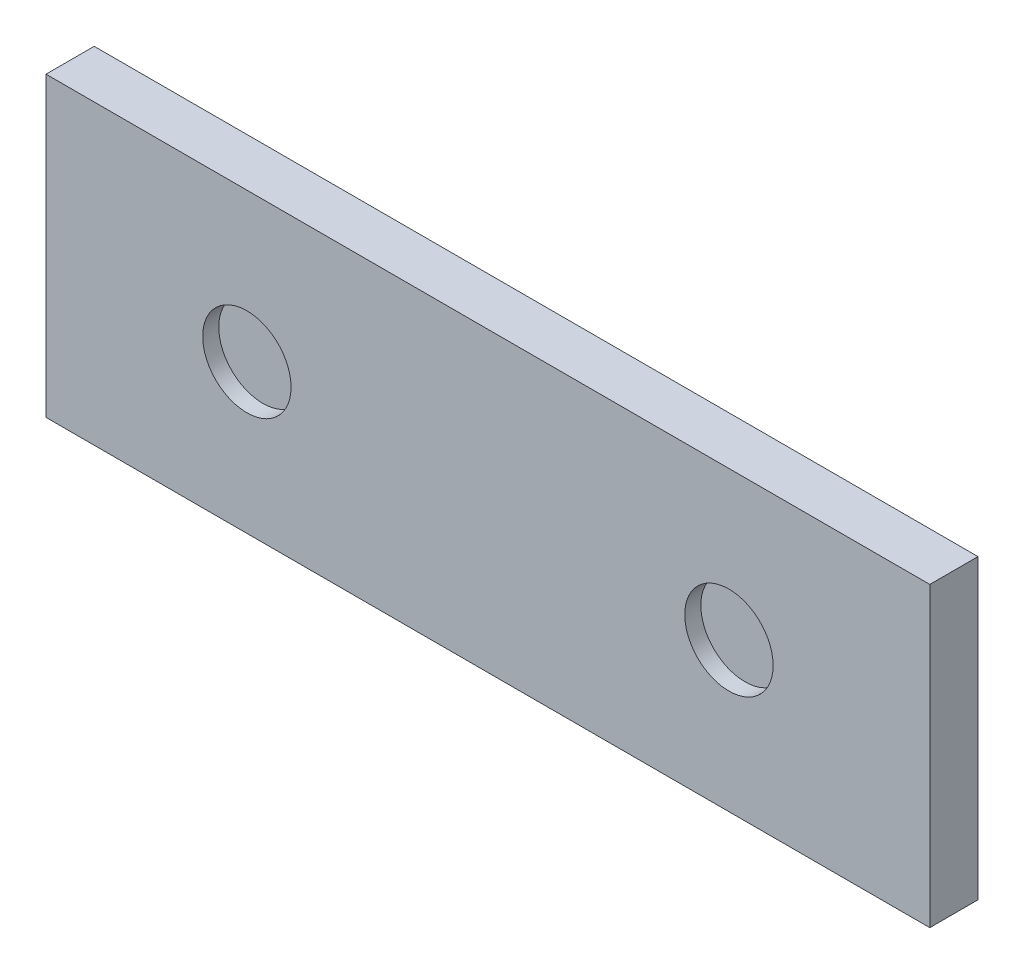
ISO-10303-21;
HEADER;
FILE_DESCRIPTION(('STEP AP214'),'2;1');
FILE_NAME('part.step','',(''),(''),'','','');
FILE_SCHEMA(('AUTOMOTIVE_DESIGN { 1 0 10303 214 1 1 1 1 }'));
ENDSEC;
DATA;
#1=APPLICATION_CONTEXT('core data for automotive mechanical design processes');
#2=APPLICATION_PROTOCOL_DEFINITION('international standard','automotive_design',2000,#1);
#3=PRODUCT_CONTEXT('',#1,'mechanical');
#4=PRODUCT('Part','Part','',(#3));
#5=PRODUCT_RELATED_PRODUCT_CATEGORY('part','',(#4));
#6=PRODUCT_DEFINITION_FORMATION('','',#4);
#7=PRODUCT_DEFINITION_CONTEXT('part definition',#1,'design');
#8=PRODUCT_DEFINITION('design','',#6,#7);
#9=PRODUCT_DEFINITION_SHAPE('','',#8);
#10=(LENGTH_UNIT() NAMED_UNIT(*) SI_UNIT(.MILLI.,.METRE.));
#11=(NAMED_UNIT(*) PLANE_ANGLE_UNIT() SI_UNIT($,.RADIAN.));
#12=(NAMED_UNIT(*) SI_UNIT($,.STERADIAN.) SOLID_ANGLE_UNIT());
#13=UNCERTAINTY_MEASURE_WITH_UNIT(LENGTH_MEASURE(1.E-05),#10,'distance_accuracy_value','');
#14=(GEOMETRIC_REPRESENTATION_CONTEXT(3) GLOBAL_UNCERTAINTY_ASSIGNED_CONTEXT((#13)) GLOBAL_UNIT_ASSIGNED_CONTEXT((#10,
#11,#12)) REPRESENTATION_CONTEXT('',''));
#15=CARTESIAN_POINT('',(0.,0.,0.));
#16=DIRECTION('',(0.,0.,1.));
#17=DIRECTION('',(1.,0.,0.));
#18=AXIS2_PLACEMENT_3D('',#15,#16,#17);
#19=CARTESIAN_POINT('',(-27.5,9.24999999999999,1.5));
#20=DIRECTION('',(1.,0.,0.));
#21=DIRECTION('',(0.,0.,-1.));
#22=AXIS2_PLACEMENT_3D('',#19,#20,#21);
#23=PLANE('',#22);
#24=DIRECTION('',(0.,-1.,0.));
#25=VECTOR('',#24,1.);
#26=CARTESIAN_POINT('',(-27.5,9.24999999999999,-1.5));
#27=LINE('',#26,#25);
#28=CARTESIAN_POINT('',(-27.5,9.24999999999999,-1.5));
#29=VERTEX_POINT('',#28);
#30=CARTESIAN_POINT('',(-27.5,-9.25000000000001,-1.5));
#31=VERTEX_POINT('',#30);
#32=EDGE_CURVE('E96',#29,#31,#27,.T.);
#33=ORIENTED_EDGE('',*,*,#32,.T.);
#34=DIRECTION('',(0.,0.,-1.));
#35=VECTOR('',#34,1.);
#36=CARTESIAN_POINT('',(-27.5,-9.25000000000001,1.5));
#37=LINE('',#36,#35);
#38=CARTESIAN_POINT('',(-27.5,-9.25000000000001,1.5));
#39=VERTEX_POINT('',#38);
#40=EDGE_CURVE('E11',#39,#31,#37,.T.);
#41=ORIENTED_EDGE('',*,*,#40,.F.);
#42=DIRECTION('',(0.,-1.,0.));
#43=VECTOR('',#42,1.);
#44=CARTESIAN_POINT('',(-27.5,9.24999999999999,1.5));
#45=LINE('',#44,#43);
#46=CARTESIAN_POINT('',(-27.5,9.24999999999999,1.5));
#47=VERTEX_POINT('',#46);
#48=EDGE_CURVE('E84',#47,#39,#45,.T.);
#49=ORIENTED_EDGE('',*,*,#48,.F.);
#50=DIRECTION('',(0.,0.,-1.));
#51=VECTOR('',#50,1.);
#52=CARTESIAN_POINT('',(-27.5,9.24999999999999,1.5));
#53=LINE('',#52,#51);
#54=EDGE_CURVE('E92',#47,#29,#53,.T.);
#55=ORIENTED_EDGE('',*,*,#54,.T.);
#56=EDGE_LOOP('',(#33,#41,#49,#55));
#57=FACE_BOUND('',#56,.T.);
#58=ADVANCED_FACE('F33',(#57),#23,.F.);
#59=CARTESIAN_POINT('',(27.5,-9.25,1.5));
#60=DIRECTION('',(0.,1.,0.));
#61=DIRECTION('',(-1.,0.,0.));
#62=AXIS2_PLACEMENT_3D('',#59,#60,#61);
#63=PLANE('',#62);
#64=DIRECTION('',(1.,0.,0.));
#65=VECTOR('',#64,1.);
#66=CARTESIAN_POINT('',(27.5,-9.25,-1.5));
#67=LINE('',#66,#65);
#68=CARTESIAN_POINT('',(27.5,-9.25,-1.5));
#69=VERTEX_POINT('',#68);
#70=EDGE_CURVE('E88',#31,#69,#67,.T.);
#71=ORIENTED_EDGE('',*,*,#70,.T.);
#72=DIRECTION('',(0.,0.,-1.));
#73=VECTOR('',#72,1.);
#74=CARTESIAN_POINT('',(27.5,-9.25,1.5));
#75=LINE('',#74,#73);
#76=CARTESIAN_POINT('',(27.5,-9.25,1.5));
#77=VERTEX_POINT('',#76);
#78=EDGE_CURVE('E41',#77,#69,#75,.T.);
#79=ORIENTED_EDGE('',*,*,#78,.F.);
#80=DIRECTION('',(1.,0.,0.));
#81=VECTOR('',#80,1.);
#82=CARTESIAN_POINT('',(27.5,-9.25,1.5));
#83=LINE('',#82,#81);
#84=EDGE_CURVE('E79',#39,#77,#83,.T.);
#85=ORIENTED_EDGE('',*,*,#84,.F.);
#86=ORIENTED_EDGE('',*,*,#40,.T.);
#87=EDGE_LOOP('',(#71,#79,#85,#86));
#88=FACE_BOUND('',#87,.T.);
#89=ADVANCED_FACE('F87',(#88),#63,.F.);
#90=CARTESIAN_POINT('',(27.5,9.25,1.5));
#91=DIRECTION('',(-1.,0.,0.));
#92=DIRECTION('',(0.,0.,1.));
#93=AXIS2_PLACEMENT_3D('',#90,#91,#92);
#94=PLANE('',#93);
#95=DIRECTION('',(0.,1.,0.));
#96=VECTOR('',#95,1.);
#97=CARTESIAN_POINT('',(27.5,9.25,-1.5));
#98=LINE('',#97,#96);
#99=CARTESIAN_POINT('',(27.5,9.25,-1.5));
#100=VERTEX_POINT('',#99);
#101=EDGE_CURVE('E66',#69,#100,#98,.T.);
#102=ORIENTED_EDGE('',*,*,#101,.T.);
#103=DIRECTION('',(0.,0.,-1.));
#104=VECTOR('',#103,1.);
#105=CARTESIAN_POINT('',(27.5,9.25,1.5));
#106=LINE('',#105,#104);
#107=CARTESIAN_POINT('',(27.5,9.25,1.5));
#108=VERTEX_POINT('',#107);
#109=EDGE_CURVE('E89',#108,#100,#106,.T.);
#110=ORIENTED_EDGE('',*,*,#109,.F.);
#111=DIRECTION('',(0.,1.,0.));
#112=VECTOR('',#111,1.);
#113=CARTESIAN_POINT('',(27.5,9.25,1.5));
#114=LINE('',#113,#112);
#115=EDGE_CURVE('E82',#77,#108,#114,.T.);
#116=ORIENTED_EDGE('',*,*,#115,.F.);
#117=ORIENTED_EDGE('',*,*,#78,.T.);
#118=EDGE_LOOP('',(#102,#110,#116,#117));
#119=FACE_BOUND('',#118,.T.);
#120=ADVANCED_FACE('F90',(#119),#94,.F.);
#121=CARTESIAN_POINT('',(27.5,9.25,1.5));
#122=DIRECTION('',(0.,-1.,0.));
#123=DIRECTION('',(1.,0.,0.));
#124=AXIS2_PLACEMENT_3D('',#121,#122,#123);
#125=PLANE('',#124);
#126=DIRECTION('',(-1.,0.,0.));
#127=VECTOR('',#126,1.);
#128=CARTESIAN_POINT('',(27.5,9.25,-1.5));
#129=LINE('',#128,#127);
#130=EDGE_CURVE('E72',#100,#29,#129,.T.);
#131=ORIENTED_EDGE('',*,*,#130,.T.);
#132=ORIENTED_EDGE('',*,*,#54,.F.);
#133=DIRECTION('',(-1.,0.,0.));
#134=VECTOR('',#133,1.);
#135=CARTESIAN_POINT('',(27.5,9.25,1.5));
#136=LINE('',#135,#134);
#137=EDGE_CURVE('E49',#108,#47,#136,.T.);
#138=ORIENTED_EDGE('',*,*,#137,.F.);
#139=ORIENTED_EDGE('',*,*,#109,.T.);
#140=EDGE_LOOP('',(#131,#132,#138,#139));
#141=FACE_BOUND('',#140,.T.);
#142=ADVANCED_FACE('F104',(#141),#125,.F.);
#143=CARTESIAN_POINT('',(0.,0.,1.5));
#144=DIRECTION('',(0.,0.,-1.));
#145=DIRECTION('',(-1.,0.,0.));
#146=AXIS2_PLACEMENT_3D('',#143,#144,#145);
#147=PLANE('',#146);
#148=CARTESIAN_POINT('',(15.,0.,1.5));
#149=DIRECTION('',(0.,0.,1.));
#150=DIRECTION('',(1.,0.,0.));
#151=AXIS2_PLACEMENT_3D('',#148,#149,#150);
#152=CIRCLE('',#151,2.75);
#153=CARTESIAN_POINT('',(17.75,0.,1.5));
#154=VERTEX_POINT('',#153);
#155=EDGE_CURVE('E116',#154,#154,#152,.T.);
#156=ORIENTED_EDGE('',*,*,#155,.F.);
#157=EDGE_LOOP('',(#156));
#158=FACE_BOUND('',#157,.T.);
#159=CARTESIAN_POINT('',(-15.,0.,1.5));
#160=DIRECTION('',(0.,0.,1.));
#161=DIRECTION('',(1.,0.,0.));
#162=AXIS2_PLACEMENT_3D('',#159,#160,#161);
#163=CIRCLE('',#162,2.75);
#164=CARTESIAN_POINT('',(-12.25,0.,1.5));
#165=VERTEX_POINT('',#164);
#166=EDGE_CURVE('E110',#165,#165,#163,.T.);
#167=ORIENTED_EDGE('',*,*,#166,.F.);
#168=EDGE_LOOP('',(#167));
#169=FACE_BOUND('',#168,.T.);
#170=ORIENTED_EDGE('',*,*,#48,.T.);
#171=ORIENTED_EDGE('',*,*,#84,.T.);
#172=ORIENTED_EDGE('',*,*,#115,.T.);
#173=ORIENTED_EDGE('',*,*,#137,.T.);
#174=EDGE_LOOP('',(#170,#171,#172,#173));
#175=FACE_BOUND('',#174,.T.);
#176=ADVANCED_FACE('F80',(#158,#169,#175),#147,.F.);
#177=CARTESIAN_POINT('',(0.,0.,-1.5));
#178=DIRECTION('',(0.,0.,-1.));
#179=DIRECTION('',(-1.,0.,0.));
#180=AXIS2_PLACEMENT_3D('',#177,#178,#179);
#181=PLANE('',#180);
#182=ORIENTED_EDGE('',*,*,#32,.F.);
#183=ORIENTED_EDGE('',*,*,#130,.F.);
#184=ORIENTED_EDGE('',*,*,#101,.F.);
#185=ORIENTED_EDGE('',*,*,#70,.F.);
#186=EDGE_LOOP('',(#182,#183,#184,#185));
#187=FACE_BOUND('',#186,.T.);
#188=ADVANCED_FACE('F107',(#187),#181,.T.);
#189=CARTESIAN_POINT('',(-15.,0.,0.5));
#190=DIRECTION('',(0.,0.,1.));
#191=DIRECTION('',(1.,0.,0.));
#192=AXIS2_PLACEMENT_3D('',#189,#190,#191);
#193=CYLINDRICAL_SURFACE('',#192,2.75);
#194=CARTESIAN_POINT('',(-15.,0.,0.5));
#195=DIRECTION('',(0.,0.,1.));
#196=DIRECTION('',(1.,0.,0.));
#197=AXIS2_PLACEMENT_3D('',#194,#195,#196);
#198=CIRCLE('',#197,2.75);
#199=CARTESIAN_POINT('',(-12.25,0.,0.5));
#200=VERTEX_POINT('',#199);
#201=EDGE_CURVE('E99',#200,#200,#198,.T.);
#202=ORIENTED_EDGE('',*,*,#201,.F.);
#203=EDGE_LOOP('',(#202));
#204=FACE_BOUND('',#203,.T.);
#205=ORIENTED_EDGE('',*,*,#166,.T.);
#206=EDGE_LOOP('',(#205));
#207=FACE_BOUND('',#206,.T.);
#208=ADVANCED_FACE('F136',(#204,#207),#193,.F.);
#209=CARTESIAN_POINT('',(-15.,0.,0.5));
#210=DIRECTION('',(0.,0.,1.));
#211=DIRECTION('',(1.,0.,0.));
#212=AXIS2_PLACEMENT_3D('',#209,#210,#211);
#213=PLANE('',#212);
#214=ORIENTED_EDGE('',*,*,#201,.T.);
#215=EDGE_LOOP('',(#214));
#216=FACE_BOUND('',#215,.T.);
#217=ADVANCED_FACE('F127',(#216),#213,.T.);
#218=CARTESIAN_POINT('',(15.,0.,0.5));
#219=DIRECTION('',(0.,0.,1.));
#220=DIRECTION('',(1.,0.,0.));
#221=AXIS2_PLACEMENT_3D('',#218,#219,#220);
#222=CYLINDRICAL_SURFACE('',#221,2.75);
#223=CARTESIAN_POINT('',(15.,0.,0.5));
#224=DIRECTION('',(0.,0.,1.));
#225=DIRECTION('',(1.,0.,0.));
#226=AXIS2_PLACEMENT_3D('',#223,#224,#225);
#227=CIRCLE('',#226,2.75);
#228=CARTESIAN_POINT('',(17.75,0.,0.5));
#229=VERTEX_POINT('',#228);
#230=EDGE_CURVE('E113',#229,#229,#227,.T.);
#231=ORIENTED_EDGE('',*,*,#230,.F.);
#232=EDGE_LOOP('',(#231));
#233=FACE_BOUND('',#232,.T.);
#234=ORIENTED_EDGE('',*,*,#155,.T.);
#235=EDGE_LOOP('',(#234));
#236=FACE_BOUND('',#235,.T.);
#237=ADVANCED_FACE('F124',(#233,#236),#222,.F.);
#238=CARTESIAN_POINT('',(15.,0.,0.5));
#239=DIRECTION('',(0.,0.,1.));
#240=DIRECTION('',(1.,0.,0.));
#241=AXIS2_PLACEMENT_3D('',#238,#239,#240);
#242=PLANE('',#241);
#243=ORIENTED_EDGE('',*,*,#230,.T.);
#244=EDGE_LOOP('',(#243));
#245=FACE_BOUND('',#244,.T.);
#246=ADVANCED_FACE('F122',(#245),#242,.T.);
#247=CLOSED_SHELL('',(#58,#89,#120,#142,#176,#188,#208,#217,#237,#246));
#248=MANIFOLD_SOLID_BREP('B2',#247);
#249=ADVANCED_BREP_SHAPE_REPRESENTATION('',(#18,#248),#14);
#250=SHAPE_DEFINITION_REPRESENTATION(#9,#249);
ENDSEC;
END-ISO-10303-21;
